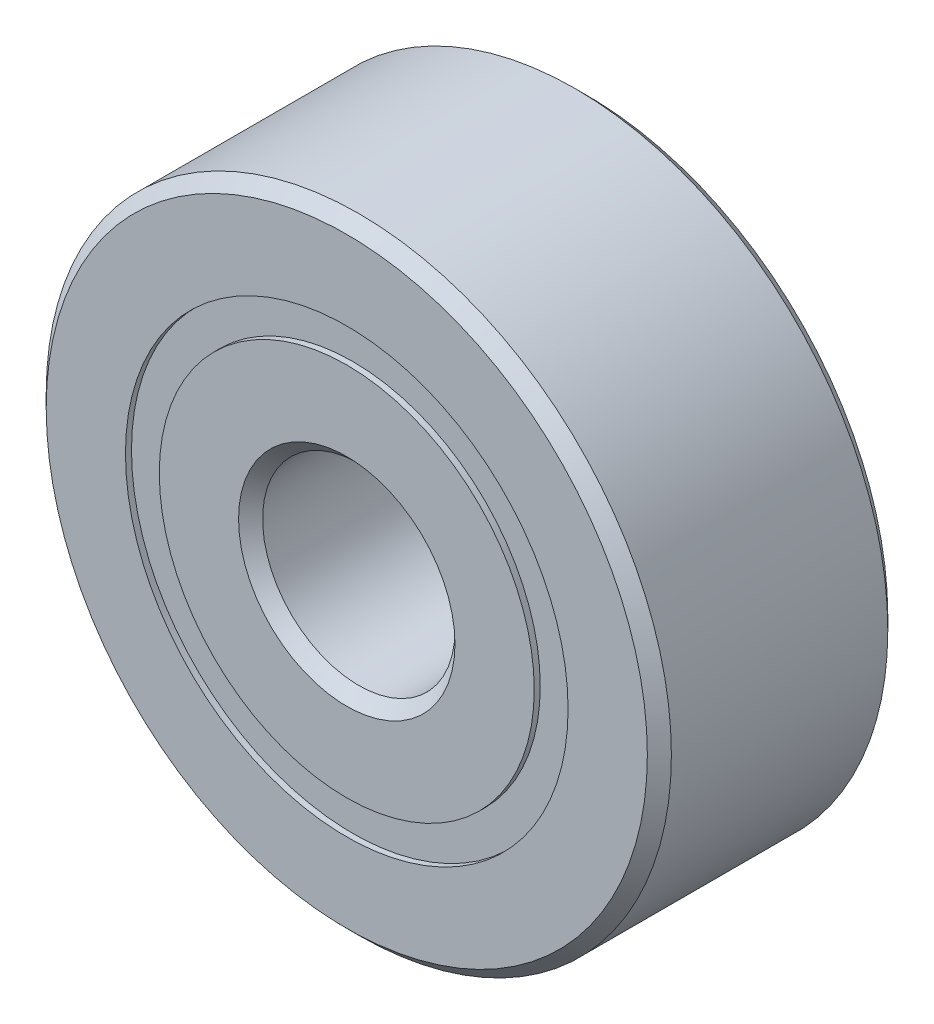
ISO-10303-21;
HEADER;
FILE_DESCRIPTION(('STEP AP214'),'2;1');
FILE_NAME('part.step','',(''),(''),'','','');
FILE_SCHEMA(('AUTOMOTIVE_DESIGN { 1 0 10303 214 1 1 1 1 }'));
ENDSEC;
DATA;
#1=APPLICATION_CONTEXT('core data for automotive mechanical design processes');
#2=APPLICATION_PROTOCOL_DEFINITION('international standard','automotive_design',2000,#1);
#3=PRODUCT_CONTEXT('',#1,'mechanical');
#4=PRODUCT('Part','Part','',(#3));
#5=PRODUCT_RELATED_PRODUCT_CATEGORY('part','',(#4));
#6=PRODUCT_DEFINITION_FORMATION('','',#4);
#7=PRODUCT_DEFINITION_CONTEXT('part definition',#1,'design');
#8=PRODUCT_DEFINITION('design','',#6,#7);
#9=PRODUCT_DEFINITION_SHAPE('','',#8);
#10=(LENGTH_UNIT() NAMED_UNIT(*) SI_UNIT(.MILLI.,.METRE.));
#11=(NAMED_UNIT(*) PLANE_ANGLE_UNIT() SI_UNIT($,.RADIAN.));
#12=(NAMED_UNIT(*) SI_UNIT($,.STERADIAN.) SOLID_ANGLE_UNIT());
#13=UNCERTAINTY_MEASURE_WITH_UNIT(LENGTH_MEASURE(1.E-05),#10,'distance_accuracy_value','');
#14=(GEOMETRIC_REPRESENTATION_CONTEXT(3) GLOBAL_UNCERTAINTY_ASSIGNED_CONTEXT((#13)) GLOBAL_UNIT_ASSIGNED_CONTEXT((#10,
#11,#12)) REPRESENTATION_CONTEXT('',''));
#15=CARTESIAN_POINT('',(0.,0.,0.));
#16=DIRECTION('',(0.,0.,1.));
#17=DIRECTION('',(1.,0.,0.));
#18=AXIS2_PLACEMENT_3D('',#15,#16,#17);
#19=CARTESIAN_POINT('',(0.,4.60164835164835,-2.375));
#20=DIRECTION('',(0.,0.,1.));
#21=DIRECTION('',(1.,0.,0.));
#22=AXIS2_PLACEMENT_3D('',#19,#20,#21);
#23=PLANE('',#22);
#24=CARTESIAN_POINT('',(0.,0.,-2.375));
#25=DIRECTION('',(0.,0.,1.));
#26=DIRECTION('',(1.,0.,0.));
#27=AXIS2_PLACEMENT_3D('',#24,#25,#26);
#28=CIRCLE('',#27,4.60164835164835);
#29=CARTESIAN_POINT('',(4.60164835164835,0.,-2.375));
#30=VERTEX_POINT('',#29);
#31=EDGE_CURVE('E67',#30,#30,#28,.T.);
#32=ORIENTED_EDGE('',*,*,#31,.F.);
#33=EDGE_LOOP('',(#32));
#34=FACE_BOUND('',#33,.T.);
#35=CARTESIAN_POINT('',(0.,0.,-2.375));
#36=DIRECTION('',(0.,0.,1.));
#37=DIRECTION('',(1.,0.,0.));
#38=AXIS2_PLACEMENT_3D('',#35,#36,#37);
#39=CIRCLE('',#38,3.89835164835165);
#40=CARTESIAN_POINT('',(3.89835164835165,0.,-2.375));
#41=VERTEX_POINT('',#40);
#42=EDGE_CURVE('E11',#41,#41,#39,.T.);
#43=ORIENTED_EDGE('',*,*,#42,.T.);
#44=EDGE_LOOP('',(#43));
#45=FACE_BOUND('',#44,.T.);
#46=ADVANCED_FACE('F48',(#34,#45),#23,.F.);
#47=CARTESIAN_POINT('',(0.,0.,2.5));
#48=DIRECTION('',(0.,0.,1.));
#49=DIRECTION('',(1.,0.,0.));
#50=AXIS2_PLACEMENT_3D('',#47,#48,#49);
#51=CYLINDRICAL_SURFACE('',#50,3.89835164835165);
#52=ORIENTED_EDGE('',*,*,#42,.F.);
#53=EDGE_LOOP('',(#52));
#54=FACE_BOUND('',#53,.T.);
#55=CARTESIAN_POINT('',(0.,0.,-1.16542887575844));
#56=DIRECTION('',(0.,0.,1.));
#57=DIRECTION('',(1.,0.,0.));
#58=AXIS2_PLACEMENT_3D('',#55,#56,#57);
#59=CIRCLE('',#58,3.89835164835165);
#60=CARTESIAN_POINT('',(3.89835164835165,0.,-1.16542887575844));
#61=VERTEX_POINT('',#60);
#62=EDGE_CURVE('E55',#61,#61,#59,.T.);
#63=ORIENTED_EDGE('',*,*,#62,.T.);
#64=EDGE_LOOP('',(#63));
#65=FACE_BOUND('',#64,.T.);
#66=ADVANCED_FACE('F78',(#54,#65),#51,.F.);
#67=CARTESIAN_POINT('',(0.,4.60164835164835,-1.16542887575844));
#68=DIRECTION('',(0.,0.,-1.));
#69=DIRECTION('',(-1.,0.,0.));
#70=AXIS2_PLACEMENT_3D('',#67,#68,#69);
#71=PLANE('',#70);
#72=ORIENTED_EDGE('',*,*,#62,.F.);
#73=EDGE_LOOP('',(#72));
#74=FACE_BOUND('',#73,.T.);
#75=CARTESIAN_POINT('',(0.,0.,-1.16542887575844));
#76=DIRECTION('',(0.,0.,1.));
#77=DIRECTION('',(1.,0.,0.));
#78=AXIS2_PLACEMENT_3D('',#75,#76,#77);
#79=CIRCLE('',#78,4.60164835164835);
#80=CARTESIAN_POINT('',(4.60164835164835,0.,-1.16542887575844));
#81=VERTEX_POINT('',#80);
#82=EDGE_CURVE('E61',#81,#81,#79,.T.);
#83=ORIENTED_EDGE('',*,*,#82,.T.);
#84=EDGE_LOOP('',(#83));
#85=FACE_BOUND('',#84,.T.);
#86=ADVANCED_FACE('F82',(#74,#85),#71,.F.);
#87=CARTESIAN_POINT('',(0.,0.,2.5));
#88=DIRECTION('',(0.,0.,1.));
#89=DIRECTION('',(1.,0.,0.));
#90=AXIS2_PLACEMENT_3D('',#87,#88,#89);
#91=CYLINDRICAL_SURFACE('',#90,4.60164835164835);
#92=ORIENTED_EDGE('',*,*,#82,.F.);
#93=EDGE_LOOP('',(#92));
#94=FACE_BOUND('',#93,.T.);
#95=ORIENTED_EDGE('',*,*,#31,.T.);
#96=EDGE_LOOP('',(#95));
#97=FACE_BOUND('',#96,.T.);
#98=ADVANCED_FACE('F75',(#94,#97),#91,.T.);
#99=CLOSED_SHELL('',(#46,#66,#86,#98));
#100=MANIFOLD_SOLID_BREP('B2',#99);
#101=CARTESIAN_POINT('',(0.,4.60164835164835,2.375));
#102=DIRECTION('',(0.,0.,-1.));
#103=DIRECTION('',(-1.,0.,0.));
#104=AXIS2_PLACEMENT_3D('',#101,#102,#103);
#105=PLANE('',#104);
#106=CARTESIAN_POINT('',(0.,0.,2.375));
#107=DIRECTION('',(0.,0.,1.));
#108=DIRECTION('',(1.,0.,0.));
#109=AXIS2_PLACEMENT_3D('',#106,#107,#108);
#110=CIRCLE('',#109,3.89835164835165);
#111=CARTESIAN_POINT('',(3.89835164835165,0.,2.375));
#112=VERTEX_POINT('',#111);
#113=EDGE_CURVE('E47',#112,#112,#110,.T.);
#114=ORIENTED_EDGE('',*,*,#113,.F.);
#115=EDGE_LOOP('',(#114));
#116=FACE_BOUND('',#115,.T.);
#117=CARTESIAN_POINT('',(0.,0.,2.375));
#118=DIRECTION('',(0.,0.,1.));
#119=DIRECTION('',(1.,0.,0.));
#120=AXIS2_PLACEMENT_3D('',#117,#118,#119);
#121=CIRCLE('',#120,4.60164835164835);
#122=CARTESIAN_POINT('',(4.60164835164835,0.,2.375));
#123=VERTEX_POINT('',#122);
#124=EDGE_CURVE('E143',#123,#123,#121,.T.);
#125=ORIENTED_EDGE('',*,*,#124,.T.);
#126=EDGE_LOOP('',(#125));
#127=FACE_BOUND('',#126,.T.);
#128=ADVANCED_FACE('F124',(#116,#127),#105,.F.);
#129=CARTESIAN_POINT('',(0.,0.,2.5));
#130=DIRECTION('',(0.,0.,1.));
#131=DIRECTION('',(1.,0.,0.));
#132=AXIS2_PLACEMENT_3D('',#129,#130,#131);
#133=CYLINDRICAL_SURFACE('',#132,3.89835164835165);
#134=CARTESIAN_POINT('',(0.,0.,1.16542887575844));
#135=DIRECTION('',(0.,0.,1.));
#136=DIRECTION('',(1.,0.,0.));
#137=AXIS2_PLACEMENT_3D('',#134,#135,#136);
#138=CIRCLE('',#137,3.89835164835165);
#139=CARTESIAN_POINT('',(3.89835164835165,0.,1.16542887575844));
#140=VERTEX_POINT('',#139);
#141=EDGE_CURVE('E131',#140,#140,#138,.T.);
#142=ORIENTED_EDGE('',*,*,#141,.F.);
#143=EDGE_LOOP('',(#142));
#144=FACE_BOUND('',#143,.T.);
#145=ORIENTED_EDGE('',*,*,#113,.T.);
#146=EDGE_LOOP('',(#145));
#147=FACE_BOUND('',#146,.T.);
#148=ADVANCED_FACE('F160',(#144,#147),#133,.F.);
#149=CARTESIAN_POINT('',(0.,4.60164835164835,1.16542887575844));
#150=DIRECTION('',(0.,0.,1.));
#151=DIRECTION('',(1.,0.,0.));
#152=AXIS2_PLACEMENT_3D('',#149,#150,#151);
#153=PLANE('',#152);
#154=CARTESIAN_POINT('',(0.,0.,1.16542887575844));
#155=DIRECTION('',(0.,0.,1.));
#156=DIRECTION('',(1.,0.,0.));
#157=AXIS2_PLACEMENT_3D('',#154,#155,#156);
#158=CIRCLE('',#157,4.60164835164835);
#159=CARTESIAN_POINT('',(4.60164835164835,0.,1.16542887575844));
#160=VERTEX_POINT('',#159);
#161=EDGE_CURVE('E137',#160,#160,#158,.T.);
#162=ORIENTED_EDGE('',*,*,#161,.F.);
#163=EDGE_LOOP('',(#162));
#164=FACE_BOUND('',#163,.T.);
#165=ORIENTED_EDGE('',*,*,#141,.T.);
#166=EDGE_LOOP('',(#165));
#167=FACE_BOUND('',#166,.T.);
#168=ADVANCED_FACE('F155',(#164,#167),#153,.F.);
#169=CARTESIAN_POINT('',(0.,0.,2.5));
#170=DIRECTION('',(0.,0.,1.));
#171=DIRECTION('',(1.,0.,0.));
#172=AXIS2_PLACEMENT_3D('',#169,#170,#171);
#173=CYLINDRICAL_SURFACE('',#172,4.60164835164835);
#174=ORIENTED_EDGE('',*,*,#124,.F.);
#175=EDGE_LOOP('',(#174));
#176=FACE_BOUND('',#175,.T.);
#177=ORIENTED_EDGE('',*,*,#161,.T.);
#178=EDGE_LOOP('',(#177));
#179=FACE_BOUND('',#178,.T.);
#180=ADVANCED_FACE('F152',(#176,#179),#173,.T.);
#181=CLOSED_SHELL('',(#128,#148,#168,#180));
#182=MANIFOLD_SOLID_BREP('B6',#181);
#183=CARTESIAN_POINT('',(-2.12499999999995,3.68060796608389,0.));
#184=DIRECTION('',(0.,0.,1.));
#185=DIRECTION('',(-0.499999999999989,0.866025403784445,0.));
#186=AXIS2_PLACEMENT_3D('',#183,#184,#185);
#187=SPHERICAL_SURFACE('',#186,1.16542887575844);
#188=CARTESIAN_POINT('',(-2.12499999999995,3.68060796608389,1.16542887575844));
#189=VERTEX_POINT('',#188);
#190=VERTEX_LOOP('',#189);
#191=FACE_BOUND('',#190,.T.);
#192=ADVANCED_FACE('F200',(#191),#187,.T.);
#193=CLOSED_SHELL('',(#192));
#194=MANIFOLD_SOLID_BREP('B42',#193);
#195=CARTESIAN_POINT('',(-3.68060796608384,2.12500000000004,0.));
#196=DIRECTION('',(0.,0.,1.));
#197=DIRECTION('',(-0.866025403784433,0.50000000000001,0.));
#198=AXIS2_PLACEMENT_3D('',#195,#196,#197);
#199=SPHERICAL_SURFACE('',#198,1.16542887575844);
#200=CARTESIAN_POINT('',(-3.68060796608384,2.12500000000004,1.16542887575844));
#201=VERTEX_POINT('',#200);
#202=VERTEX_LOOP('',#201);
#203=FACE_BOUND('',#202,.T.);
#204=ADVANCED_FACE('F221',(#203),#199,.T.);
#205=CLOSED_SHELL('',(#204));
#206=MANIFOLD_SOLID_BREP('B120',#205);
#207=CARTESIAN_POINT('',(-4.25,0.,0.));
#208=DIRECTION('',(0.,0.,1.));
#209=DIRECTION('',(-1.,0.,0.));
#210=AXIS2_PLACEMENT_3D('',#207,#208,#209);
#211=SPHERICAL_SURFACE('',#210,1.16542887575844);
#212=CARTESIAN_POINT('',(-4.25,0.,1.16542887575844));
#213=VERTEX_POINT('',#212);
#214=VERTEX_LOOP('',#213);
#215=FACE_BOUND('',#214,.T.);
#216=ADVANCED_FACE('F242',(#215),#211,.T.);
#217=CLOSED_SHELL('',(#216));
#218=MANIFOLD_SOLID_BREP('B196',#217);
#219=CARTESIAN_POINT('',(-3.68060796608388,-2.12499999999997,0.));
#220=DIRECTION('',(0.,0.,1.));
#221=DIRECTION('',(-0.866025403784443,-0.499999999999992,0.));
#222=AXIS2_PLACEMENT_3D('',#219,#220,#221);
#223=SPHERICAL_SURFACE('',#222,1.16542887575844);
#224=CARTESIAN_POINT('',(-3.68060796608388,-2.12499999999997,1.16542887575844));
#225=VERTEX_POINT('',#224);
#226=VERTEX_LOOP('',#225);
#227=FACE_BOUND('',#226,.T.);
#228=ADVANCED_FACE('F263',(#227),#223,.T.);
#229=CLOSED_SHELL('',(#228));
#230=MANIFOLD_SOLID_BREP('B217',#229);
#231=CARTESIAN_POINT('',(-2.12500000000003,-3.68060796608385,0.));
#232=DIRECTION('',(0.,0.,1.));
#233=DIRECTION('',(-0.500000000000007,-0.866025403784435,0.));
#234=AXIS2_PLACEMENT_3D('',#231,#232,#233);
#235=SPHERICAL_SURFACE('',#234,1.16542887575844);
#236=CARTESIAN_POINT('',(-2.12500000000003,-3.68060796608385,1.16542887575844));
#237=VERTEX_POINT('',#236);
#238=VERTEX_LOOP('',#237);
#239=FACE_BOUND('',#238,.T.);
#240=ADVANCED_FACE('F284',(#239),#235,.T.);
#241=CLOSED_SHELL('',(#240));
#242=MANIFOLD_SOLID_BREP('B238',#241);
#243=CARTESIAN_POINT('',(0.,-4.25,0.));
#244=DIRECTION('',(0.,0.,1.));
#245=DIRECTION('',(0.,-1.,0.));
#246=AXIS2_PLACEMENT_3D('',#243,#244,#245);
#247=SPHERICAL_SURFACE('',#246,1.16542887575844);
#248=CARTESIAN_POINT('',(0.,-4.25,1.16542887575844));
#249=VERTEX_POINT('',#248);
#250=VERTEX_LOOP('',#249);
#251=FACE_BOUND('',#250,.T.);
#252=ADVANCED_FACE('F305',(#251),#247,.T.);
#253=CLOSED_SHELL('',(#252));
#254=MANIFOLD_SOLID_BREP('B259',#253);
#255=CARTESIAN_POINT('',(2.12499999999998,-3.68060796608388,0.));
#256=DIRECTION('',(0.,0.,1.));
#257=DIRECTION('',(0.499999999999995,-0.866025403784442,0.));
#258=AXIS2_PLACEMENT_3D('',#255,#256,#257);
#259=SPHERICAL_SURFACE('',#258,1.16542887575844);
#260=CARTESIAN_POINT('',(2.12499999999998,-3.68060796608388,1.16542887575844));
#261=VERTEX_POINT('',#260);
#262=VERTEX_LOOP('',#261);
#263=FACE_BOUND('',#262,.T.);
#264=ADVANCED_FACE('F326',(#263),#259,.T.);
#265=CLOSED_SHELL('',(#264));
#266=MANIFOLD_SOLID_BREP('B280',#265);
#267=CARTESIAN_POINT('',(3.68060796608386,-2.12500000000002,0.));
#268=DIRECTION('',(0.,0.,1.));
#269=DIRECTION('',(0.866025403784436,-0.500000000000004,0.));
#270=AXIS2_PLACEMENT_3D('',#267,#268,#269);
#271=SPHERICAL_SURFACE('',#270,1.16542887575844);
#272=CARTESIAN_POINT('',(3.68060796608386,-2.12500000000002,1.16542887575844));
#273=VERTEX_POINT('',#272);
#274=VERTEX_LOOP('',#273);
#275=FACE_BOUND('',#274,.T.);
#276=ADVANCED_FACE('F347',(#275),#271,.T.);
#277=CLOSED_SHELL('',(#276));
#278=MANIFOLD_SOLID_BREP('B301',#277);
#279=CARTESIAN_POINT('',(4.25,0.,0.));
#280=DIRECTION('',(0.,0.,1.));
#281=DIRECTION('',(1.,0.,0.));
#282=AXIS2_PLACEMENT_3D('',#279,#280,#281);
#283=SPHERICAL_SURFACE('',#282,1.16542887575844);
#284=CARTESIAN_POINT('',(4.25,0.,1.16542887575844));
#285=VERTEX_POINT('',#284);
#286=VERTEX_LOOP('',#285);
#287=FACE_BOUND('',#286,.T.);
#288=ADVANCED_FACE('F368',(#287),#283,.T.);
#289=CLOSED_SHELL('',(#288));
#290=MANIFOLD_SOLID_BREP('B322',#289);
#291=CARTESIAN_POINT('',(3.68060796608387,2.12499999999999,0.));
#292=DIRECTION('',(0.,0.,1.));
#293=DIRECTION('',(0.86602540378444,0.499999999999998,0.));
#294=AXIS2_PLACEMENT_3D('',#291,#292,#293);
#295=SPHERICAL_SURFACE('',#294,1.16542887575844);
#296=CARTESIAN_POINT('',(3.68060796608387,2.12499999999999,1.16542887575844));
#297=VERTEX_POINT('',#296);
#298=VERTEX_LOOP('',#297);
#299=FACE_BOUND('',#298,.T.);
#300=ADVANCED_FACE('F389',(#299),#295,.T.);
#301=CLOSED_SHELL('',(#300));
#302=MANIFOLD_SOLID_BREP('B343',#301);
#303=CARTESIAN_POINT('',(2.125,3.68060796608386,0.));
#304=DIRECTION('',(0.,0.,1.));
#305=DIRECTION('',(0.500000000000001,0.866025403784438,0.));
#306=AXIS2_PLACEMENT_3D('',#303,#304,#305);
#307=SPHERICAL_SURFACE('',#306,1.16542887575844);
#308=CARTESIAN_POINT('',(2.125,3.68060796608386,1.16542887575844));
#309=VERTEX_POINT('',#308);
#310=VERTEX_LOOP('',#309);
#311=FACE_BOUND('',#310,.T.);
#312=ADVANCED_FACE('F410',(#311),#307,.T.);
#313=CLOSED_SHELL('',(#312));
#314=MANIFOLD_SOLID_BREP('B364',#313);
#315=CARTESIAN_POINT('',(0.,4.25,0.));
#316=DIRECTION('',(0.,0.,1.));
#317=DIRECTION('',(0.,1.,0.));
#318=AXIS2_PLACEMENT_3D('',#315,#316,#317);
#319=SPHERICAL_SURFACE('',#318,1.16542887575844);
#320=CARTESIAN_POINT('',(0.,4.25,1.16542887575844));
#321=VERTEX_POINT('',#320);
#322=VERTEX_LOOP('',#321);
#323=FACE_BOUND('',#322,.T.);
#324=ADVANCED_FACE('F433',(#323),#319,.T.);
#325=CLOSED_SHELL('',(#324));
#326=MANIFOLD_SOLID_BREP('B385',#325);
#327=CARTESIAN_POINT('',(0.,3.89835164835165,2.5));
#328=DIRECTION('',(0.,0.,-1.));
#329=DIRECTION('',(-1.,0.,0.));
#330=AXIS2_PLACEMENT_3D('',#327,#328,#329);
#331=PLANE('',#330);
#332=CARTESIAN_POINT('',(0.,0.,2.5));
#333=DIRECTION('',(0.,0.,1.));
#334=DIRECTION('',(1.,0.,0.));
#335=AXIS2_PLACEMENT_3D('',#332,#333,#334);
#336=CIRCLE('',#335,2.25);
#337=CARTESIAN_POINT('',(2.25,0.,2.5));
#338=VERTEX_POINT('',#337);
#339=EDGE_CURVE('E490',#338,#338,#336,.T.);
#340=ORIENTED_EDGE('',*,*,#339,.F.);
#341=EDGE_LOOP('',(#340));
#342=FACE_BOUND('',#341,.T.);
#343=CARTESIAN_POINT('',(0.,0.,2.5));
#344=DIRECTION('',(0.,0.,1.));
#345=DIRECTION('',(1.,0.,0.));
#346=AXIS2_PLACEMENT_3D('',#343,#344,#345);
#347=CIRCLE('',#346,3.89835164835165);
#348=CARTESIAN_POINT('',(3.89835164835165,0.,2.5));
#349=VERTEX_POINT('',#348);
#350=EDGE_CURVE('E432',#349,#349,#347,.T.);
#351=ORIENTED_EDGE('',*,*,#350,.T.);
#352=EDGE_LOOP('',(#351));
#353=FACE_BOUND('',#352,.T.);
#354=ADVANCED_FACE('F453',(#342,#353),#331,.F.);
#355=CARTESIAN_POINT('',(0.,0.,2.5));
#356=DIRECTION('',(0.,0.,1.));
#357=DIRECTION('',(1.,0.,0.));
#358=AXIS2_PLACEMENT_3D('',#355,#356,#357);
#359=CYLINDRICAL_SURFACE('',#358,3.89835164835165);
#360=ORIENTED_EDGE('',*,*,#350,.F.);
#361=EDGE_LOOP('',(#360));
#362=FACE_BOUND('',#361,.T.);
#363=CARTESIAN_POINT('',(0.,0.,1.11111111111111));
#364=DIRECTION('',(0.,0.,1.));
#365=DIRECTION('',(1.,0.,0.));
#366=AXIS2_PLACEMENT_3D('',#363,#364,#365);
#367=CIRCLE('',#366,3.89835164835165);
#368=CARTESIAN_POINT('',(3.89835164835165,0.,1.11111111111111));
#369=VERTEX_POINT('',#368);
#370=EDGE_CURVE('E460',#369,#369,#367,.T.);
#371=ORIENTED_EDGE('',*,*,#370,.T.);
#372=EDGE_LOOP('',(#371));
#373=FACE_BOUND('',#372,.T.);
#374=ADVANCED_FACE('F499',(#362,#373),#359,.T.);
#375=CARTESIAN_POINT('',(0.,0.,0.));
#376=DIRECTION('',(0.,0.,1.));
#377=DIRECTION('',(1.,0.,0.));
#378=AXIS2_PLACEMENT_3D('',#375,#376,#377);
#379=TOROIDAL_SURFACE('',#378,4.25,1.16542887575843);
#380=ORIENTED_EDGE('',*,*,#370,.F.);
#381=EDGE_LOOP('',(#380));
#382=FACE_BOUND('',#381,.T.);
#383=CARTESIAN_POINT('',(0.,0.,-1.11111111111111));
#384=DIRECTION('',(0.,0.,1.));
#385=DIRECTION('',(1.,0.,0.));
#386=AXIS2_PLACEMENT_3D('',#383,#384,#385);
#387=CIRCLE('',#386,3.89835164835165);
#388=CARTESIAN_POINT('',(3.89835164835165,0.,-1.11111111111111));
#389=VERTEX_POINT('',#388);
#390=EDGE_CURVE('E466',#389,#389,#387,.T.);
#391=ORIENTED_EDGE('',*,*,#390,.T.);
#392=EDGE_LOOP('',(#391));
#393=FACE_BOUND('',#392,.T.);
#394=ADVANCED_FACE('F503',(#382,#393),#379,.F.);
#395=CARTESIAN_POINT('',(0.,0.,2.5));
#396=DIRECTION('',(0.,0.,1.));
#397=DIRECTION('',(1.,0.,0.));
#398=AXIS2_PLACEMENT_3D('',#395,#396,#397);
#399=CYLINDRICAL_SURFACE('',#398,3.89835164835165);
#400=ORIENTED_EDGE('',*,*,#390,.F.);
#401=EDGE_LOOP('',(#400));
#402=FACE_BOUND('',#401,.T.);
#403=CARTESIAN_POINT('',(0.,0.,-2.5));
#404=DIRECTION('',(0.,0.,1.));
#405=DIRECTION('',(1.,0.,0.));
#406=AXIS2_PLACEMENT_3D('',#403,#404,#405);
#407=CIRCLE('',#406,3.89835164835165);
#408=CARTESIAN_POINT('',(3.89835164835165,0.,-2.5));
#409=VERTEX_POINT('',#408);
#410=EDGE_CURVE('E472',#409,#409,#407,.T.);
#411=ORIENTED_EDGE('',*,*,#410,.T.);
#412=EDGE_LOOP('',(#411));
#413=FACE_BOUND('',#412,.T.);
#414=ADVANCED_FACE('F508',(#402,#413),#399,.T.);
#415=CARTESIAN_POINT('',(0.,2.25,-2.5));
#416=DIRECTION('',(0.,0.,1.));
#417=DIRECTION('',(1.,0.,0.));
#418=AXIS2_PLACEMENT_3D('',#415,#416,#417);
#419=PLANE('',#418);
#420=ORIENTED_EDGE('',*,*,#410,.F.);
#421=EDGE_LOOP('',(#420));
#422=FACE_BOUND('',#421,.T.);
#423=CARTESIAN_POINT('',(0.,0.,-2.5));
#424=DIRECTION('',(0.,0.,1.));
#425=DIRECTION('',(1.,0.,0.));
#426=AXIS2_PLACEMENT_3D('',#423,#424,#425);
#427=CIRCLE('',#426,2.25);
#428=CARTESIAN_POINT('',(2.25,0.,-2.5));
#429=VERTEX_POINT('',#428);
#430=EDGE_CURVE('E478',#429,#429,#427,.T.);
#431=ORIENTED_EDGE('',*,*,#430,.T.);
#432=EDGE_LOOP('',(#431));
#433=FACE_BOUND('',#432,.T.);
#434=ADVANCED_FACE('F514',(#422,#433),#419,.F.);
#435=CARTESIAN_POINT('',(0.,0.,-2.25));
#436=DIRECTION('',(0.,0.,-1.));
#437=DIRECTION('',(-1.,0.,0.));
#438=AXIS2_PLACEMENT_3D('',#435,#436,#437);
#439=CONICAL_SURFACE('',#438,2.,0.785398163397445);
#440=ORIENTED_EDGE('',*,*,#430,.F.);
#441=EDGE_LOOP('',(#440));
#442=FACE_BOUND('',#441,.T.);
#443=CARTESIAN_POINT('',(0.,0.,-2.25));
#444=DIRECTION('',(0.,0.,1.));
#445=DIRECTION('',(1.,0.,0.));
#446=AXIS2_PLACEMENT_3D('',#443,#444,#445);
#447=CIRCLE('',#446,2.);
#448=CARTESIAN_POINT('',(2.,0.,-2.25));
#449=VERTEX_POINT('',#448);
#450=EDGE_CURVE('E482',#449,#449,#447,.T.);
#451=ORIENTED_EDGE('',*,*,#450,.T.);
#452=EDGE_LOOP('',(#451));
#453=FACE_BOUND('',#452,.T.);
#454=ADVANCED_FACE('F518',(#442,#453),#439,.F.);
#455=CARTESIAN_POINT('',(0.,0.,2.5));
#456=DIRECTION('',(0.,0.,1.));
#457=DIRECTION('',(1.,0.,0.));
#458=AXIS2_PLACEMENT_3D('',#455,#456,#457);
#459=CYLINDRICAL_SURFACE('',#458,2.);
#460=ORIENTED_EDGE('',*,*,#450,.F.);
#461=EDGE_LOOP('',(#460));
#462=FACE_BOUND('',#461,.T.);
#463=CARTESIAN_POINT('',(0.,0.,2.25));
#464=DIRECTION('',(0.,0.,1.));
#465=DIRECTION('',(1.,0.,0.));
#466=AXIS2_PLACEMENT_3D('',#463,#464,#465);
#467=CIRCLE('',#466,2.);
#468=CARTESIAN_POINT('',(2.,0.,2.25));
#469=VERTEX_POINT('',#468);
#470=EDGE_CURVE('E486',#469,#469,#467,.T.);
#471=ORIENTED_EDGE('',*,*,#470,.T.);
#472=EDGE_LOOP('',(#471));
#473=FACE_BOUND('',#472,.T.);
#474=ADVANCED_FACE('F522',(#462,#473),#459,.F.);
#475=CARTESIAN_POINT('',(0.,0.,2.5));
#476=DIRECTION('',(0.,0.,1.));
#477=DIRECTION('',(1.,0.,0.));
#478=AXIS2_PLACEMENT_3D('',#475,#476,#477);
#479=CONICAL_SURFACE('',#478,2.25,0.785398163397452);
#480=ORIENTED_EDGE('',*,*,#470,.F.);
#481=EDGE_LOOP('',(#480));
#482=FACE_BOUND('',#481,.T.);
#483=ORIENTED_EDGE('',*,*,#339,.T.);
#484=EDGE_LOOP('',(#483));
#485=FACE_BOUND('',#484,.T.);
#486=ADVANCED_FACE('F496',(#482,#485),#479,.F.);
#487=CLOSED_SHELL('',(#354,#374,#394,#414,#434,#454,#474,#486));
#488=MANIFOLD_SOLID_BREP('B406',#487);
#489=CARTESIAN_POINT('',(0.,0.,2.25));
#490=DIRECTION('',(0.,0.,-1.));
#491=DIRECTION('',(-1.,0.,0.));
#492=AXIS2_PLACEMENT_3D('',#489,#490,#491);
#493=CONICAL_SURFACE('',#492,6.5,0.785398163397445);
#494=CARTESIAN_POINT('',(0.,0.,2.5));
#495=DIRECTION('',(0.,0.,1.));
#496=DIRECTION('',(1.,0.,0.));
#497=AXIS2_PLACEMENT_3D('',#494,#495,#496);
#498=CIRCLE('',#497,6.25);
#499=CARTESIAN_POINT('',(6.25,0.,2.5));
#500=VERTEX_POINT('',#499);
#501=EDGE_CURVE('E628',#500,#500,#498,.T.);
#502=ORIENTED_EDGE('',*,*,#501,.F.);
#503=EDGE_LOOP('',(#502));
#504=FACE_BOUND('',#503,.T.);
#505=CARTESIAN_POINT('',(0.,0.,2.25));
#506=DIRECTION('',(0.,0.,1.));
#507=DIRECTION('',(1.,0.,0.));
#508=AXIS2_PLACEMENT_3D('',#505,#506,#507);
#509=CIRCLE('',#508,6.5);
#510=CARTESIAN_POINT('',(6.5,0.,2.25));
#511=VERTEX_POINT('',#510);
#512=EDGE_CURVE('E452',#511,#511,#509,.T.);
#513=ORIENTED_EDGE('',*,*,#512,.T.);
#514=EDGE_LOOP('',(#513));
#515=FACE_BOUND('',#514,.T.);
#516=ADVANCED_FACE('F591',(#504,#515),#493,.T.);
#517=CARTESIAN_POINT('',(0.,0.,2.5));
#518=DIRECTION('',(0.,0.,1.));
#519=DIRECTION('',(1.,0.,0.));
#520=AXIS2_PLACEMENT_3D('',#517,#518,#519);
#521=CYLINDRICAL_SURFACE('',#520,6.5);
#522=ORIENTED_EDGE('',*,*,#512,.F.);
#523=EDGE_LOOP('',(#522));
#524=FACE_BOUND('',#523,.T.);
#525=CARTESIAN_POINT('',(0.,0.,-2.25));
#526=DIRECTION('',(0.,0.,1.));
#527=DIRECTION('',(1.,0.,0.));
#528=AXIS2_PLACEMENT_3D('',#525,#526,#527);
#529=CIRCLE('',#528,6.5);
#530=CARTESIAN_POINT('',(6.5,0.,-2.25));
#531=VERTEX_POINT('',#530);
#532=EDGE_CURVE('E598',#531,#531,#529,.T.);
#533=ORIENTED_EDGE('',*,*,#532,.T.);
#534=EDGE_LOOP('',(#533));
#535=FACE_BOUND('',#534,.T.);
#536=ADVANCED_FACE('F637',(#524,#535),#521,.T.);
#537=CARTESIAN_POINT('',(0.,0.,-2.5));
#538=DIRECTION('',(0.,0.,1.));
#539=DIRECTION('',(1.,0.,0.));
#540=AXIS2_PLACEMENT_3D('',#537,#538,#539);
#541=CONICAL_SURFACE('',#540,6.25,0.785398163397445);
#542=ORIENTED_EDGE('',*,*,#532,.F.);
#543=EDGE_LOOP('',(#542));
#544=FACE_BOUND('',#543,.T.);
#545=CARTESIAN_POINT('',(0.,0.,-2.5));
#546=DIRECTION('',(0.,0.,1.));
#547=DIRECTION('',(1.,0.,0.));
#548=AXIS2_PLACEMENT_3D('',#545,#546,#547);
#549=CIRCLE('',#548,6.25);
#550=CARTESIAN_POINT('',(6.25,0.,-2.5));
#551=VERTEX_POINT('',#550);
#552=EDGE_CURVE('E604',#551,#551,#549,.T.);
#553=ORIENTED_EDGE('',*,*,#552,.T.);
#554=EDGE_LOOP('',(#553));
#555=FACE_BOUND('',#554,.T.);
#556=ADVANCED_FACE('F641',(#544,#555),#541,.T.);
#557=CARTESIAN_POINT('',(0.,6.25,-2.5));
#558=DIRECTION('',(0.,0.,1.));
#559=DIRECTION('',(1.,0.,0.));
#560=AXIS2_PLACEMENT_3D('',#557,#558,#559);
#561=PLANE('',#560);
#562=ORIENTED_EDGE('',*,*,#552,.F.);
#563=EDGE_LOOP('',(#562));
#564=FACE_BOUND('',#563,.T.);
#565=CARTESIAN_POINT('',(0.,0.,-2.5));
#566=DIRECTION('',(0.,0.,1.));
#567=DIRECTION('',(1.,0.,0.));
#568=AXIS2_PLACEMENT_3D('',#565,#566,#567);
#569=CIRCLE('',#568,4.60164835164835);
#570=CARTESIAN_POINT('',(4.60164835164835,0.,-2.5));
#571=VERTEX_POINT('',#570);
#572=EDGE_CURVE('E610',#571,#571,#569,.T.);
#573=ORIENTED_EDGE('',*,*,#572,.T.);
#574=EDGE_LOOP('',(#573));
#575=FACE_BOUND('',#574,.T.);
#576=ADVANCED_FACE('F646',(#564,#575),#561,.F.);
#577=CARTESIAN_POINT('',(0.,0.,2.5));
#578=DIRECTION('',(0.,0.,1.));
#579=DIRECTION('',(1.,0.,0.));
#580=AXIS2_PLACEMENT_3D('',#577,#578,#579);
#581=CYLINDRICAL_SURFACE('',#580,4.60164835164835);
#582=ORIENTED_EDGE('',*,*,#572,.F.);
#583=EDGE_LOOP('',(#582));
#584=FACE_BOUND('',#583,.T.);
#585=CARTESIAN_POINT('',(0.,0.,-1.11111111111111));
#586=DIRECTION('',(0.,0.,1.));
#587=DIRECTION('',(1.,0.,0.));
#588=AXIS2_PLACEMENT_3D('',#585,#586,#587);
#589=CIRCLE('',#588,4.60164835164835);
#590=CARTESIAN_POINT('',(4.60164835164835,0.,-1.11111111111111));
#591=VERTEX_POINT('',#590);
#592=EDGE_CURVE('E616',#591,#591,#589,.T.);
#593=ORIENTED_EDGE('',*,*,#592,.T.);
#594=EDGE_LOOP('',(#593));
#595=FACE_BOUND('',#594,.T.);
#596=ADVANCED_FACE('F652',(#584,#595),#581,.F.);
#597=CARTESIAN_POINT('',(0.,0.,0.));
#598=DIRECTION('',(0.,0.,1.));
#599=DIRECTION('',(1.,0.,0.));
#600=AXIS2_PLACEMENT_3D('',#597,#598,#599);
#601=TOROIDAL_SURFACE('',#600,4.25,1.16542887575844);
#602=ORIENTED_EDGE('',*,*,#592,.F.);
#603=EDGE_LOOP('',(#602));
#604=FACE_BOUND('',#603,.T.);
#605=CARTESIAN_POINT('',(0.,0.,1.11111111111111));
#606=DIRECTION('',(0.,0.,1.));
#607=DIRECTION('',(1.,0.,0.));
#608=AXIS2_PLACEMENT_3D('',#605,#606,#607);
#609=CIRCLE('',#608,4.60164835164835);
#610=CARTESIAN_POINT('',(4.60164835164835,0.,1.11111111111111));
#611=VERTEX_POINT('',#610);
#612=EDGE_CURVE('E620',#611,#611,#609,.T.);
#613=ORIENTED_EDGE('',*,*,#612,.T.);
#614=EDGE_LOOP('',(#613));
#615=FACE_BOUND('',#614,.T.);
#616=ADVANCED_FACE('F656',(#604,#615),#601,.F.);
#617=CARTESIAN_POINT('',(0.,0.,2.5));
#618=DIRECTION('',(0.,0.,1.));
#619=DIRECTION('',(1.,0.,0.));
#620=AXIS2_PLACEMENT_3D('',#617,#618,#619);
#621=CYLINDRICAL_SURFACE('',#620,4.60164835164835);
#622=ORIENTED_EDGE('',*,*,#612,.F.);
#623=EDGE_LOOP('',(#622));
#624=FACE_BOUND('',#623,.T.);
#625=CARTESIAN_POINT('',(0.,0.,2.5));
#626=DIRECTION('',(0.,0.,1.));
#627=DIRECTION('',(1.,0.,0.));
#628=AXIS2_PLACEMENT_3D('',#625,#626,#627);
#629=CIRCLE('',#628,4.60164835164835);
#630=CARTESIAN_POINT('',(4.60164835164835,0.,2.5));
#631=VERTEX_POINT('',#630);
#632=EDGE_CURVE('E624',#631,#631,#629,.T.);
#633=ORIENTED_EDGE('',*,*,#632,.T.);
#634=EDGE_LOOP('',(#633));
#635=FACE_BOUND('',#634,.T.);
#636=ADVANCED_FACE('F660',(#624,#635),#621,.F.);
#637=CARTESIAN_POINT('',(0.,6.25,2.5));
#638=DIRECTION('',(0.,0.,-1.));
#639=DIRECTION('',(-1.,0.,0.));
#640=AXIS2_PLACEMENT_3D('',#637,#638,#639);
#641=PLANE('',#640);
#642=ORIENTED_EDGE('',*,*,#632,.F.);
#643=EDGE_LOOP('',(#642));
#644=FACE_BOUND('',#643,.T.);
#645=ORIENTED_EDGE('',*,*,#501,.T.);
#646=EDGE_LOOP('',(#645));
#647=FACE_BOUND('',#646,.T.);
#648=ADVANCED_FACE('F634',(#644,#647),#641,.F.);
#649=CLOSED_SHELL('',(#516,#536,#556,#576,#596,#616,#636,#648));
#650=MANIFOLD_SOLID_BREP('B427',#649);
#651=ADVANCED_BREP_SHAPE_REPRESENTATION('',(#18,#100,#182,#194,#206,#218,#230,#242,#254,#266,
#278,#290,#302,#314,#326,#488,#650),#14);
#652=SHAPE_DEFINITION_REPRESENTATION(#9,#651);
ENDSEC;
END-ISO-10303-21;
